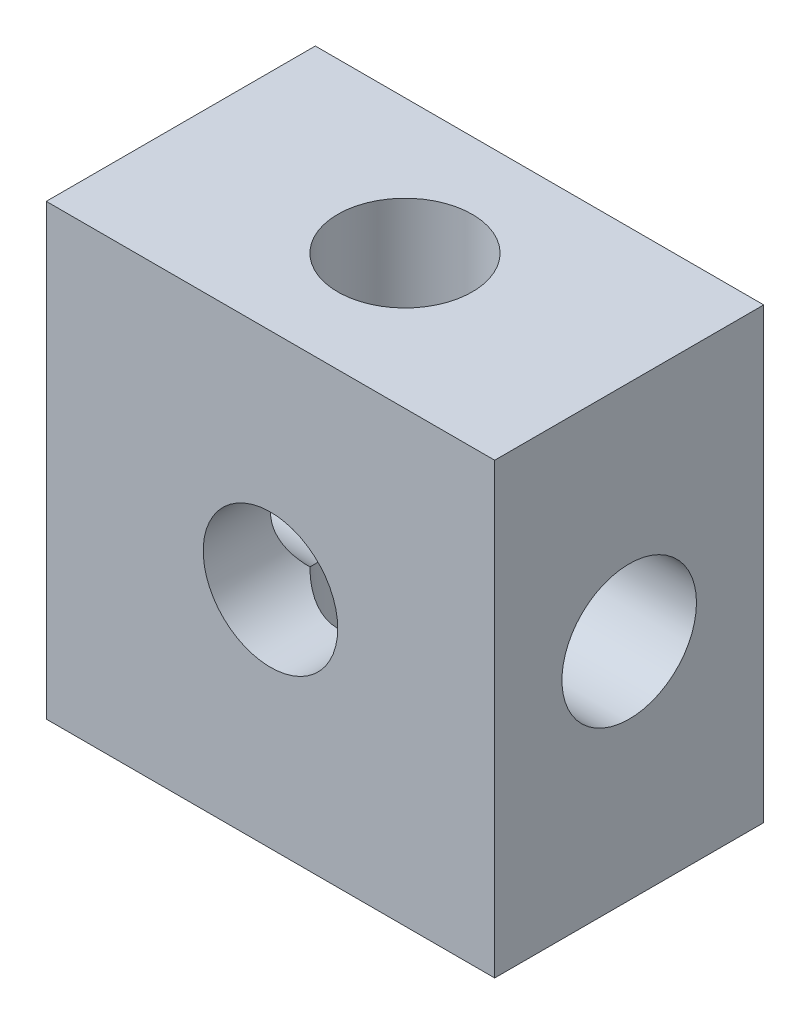
ISO-10303-21;
HEADER;
FILE_DESCRIPTION(('STEP AP214'),'2;1');
FILE_NAME('part.step','',(''),(''),'','','');
FILE_SCHEMA(('AUTOMOTIVE_DESIGN { 1 0 10303 214 1 1 1 1 }'));
ENDSEC;
DATA;
#1=APPLICATION_CONTEXT('core data for automotive mechanical design processes');
#2=APPLICATION_PROTOCOL_DEFINITION('international standard','automotive_design',2000,#1);
#3=PRODUCT_CONTEXT('',#1,'mechanical');
#4=PRODUCT('Part','Part','',(#3));
#5=PRODUCT_RELATED_PRODUCT_CATEGORY('part','',(#4));
#6=PRODUCT_DEFINITION_FORMATION('','',#4);
#7=PRODUCT_DEFINITION_CONTEXT('part definition',#1,'design');
#8=PRODUCT_DEFINITION('design','',#6,#7);
#9=PRODUCT_DEFINITION_SHAPE('','',#8);
#10=(LENGTH_UNIT() NAMED_UNIT(*) SI_UNIT(.MILLI.,.METRE.));
#11=(NAMED_UNIT(*) PLANE_ANGLE_UNIT() SI_UNIT($,.RADIAN.));
#12=(NAMED_UNIT(*) SI_UNIT($,.STERADIAN.) SOLID_ANGLE_UNIT());
#13=UNCERTAINTY_MEASURE_WITH_UNIT(LENGTH_MEASURE(1.E-05),#10,'distance_accuracy_value','');
#14=(GEOMETRIC_REPRESENTATION_CONTEXT(3) GLOBAL_UNCERTAINTY_ASSIGNED_CONTEXT((#13)) GLOBAL_UNIT_ASSIGNED_CONTEXT((#10,
#11,#12)) REPRESENTATION_CONTEXT('',''));
#15=CARTESIAN_POINT('',(0.,0.,0.));
#16=DIRECTION('',(0.,0.,1.));
#17=DIRECTION('',(1.,0.,0.));
#18=AXIS2_PLACEMENT_3D('',#15,#16,#17);
#19=CARTESIAN_POINT('',(0.,0.,0.));
#20=DIRECTION('',(0.,0.,1.));
#21=DIRECTION('',(1.,0.,0.));
#22=AXIS2_PLACEMENT_3D('',#19,#20,#21);
#23=CYLINDRICAL_SURFACE('',#22,1.5);
#24=CARTESIAN_POINT('',(0.,0.,6.));
#25=DIRECTION('',(0.,0.,1.));
#26=DIRECTION('',(1.,0.,0.));
#27=AXIS2_PLACEMENT_3D('',#24,#25,#26);
#28=CIRCLE('',#27,1.5);
#29=CARTESIAN_POINT('',(1.5,0.,6.));
#30=VERTEX_POINT('',#29);
#31=EDGE_CURVE('E144',#30,#30,#28,.T.);
#32=ORIENTED_EDGE('',*,*,#31,.T.);
#33=EDGE_LOOP('',(#32));
#34=FACE_BOUND('',#33,.T.);
#35=CARTESIAN_POINT('',(0.,0.,3.));
#36=DIRECTION('',(0.,0.707106781186547,0.707106781186548));
#37=DIRECTION('',(0.,-0.707106781186547,0.707106781186548));
#38=AXIS2_PLACEMENT_3D('',#35,#36,#37);
#39=ELLIPSE('',#38,2.12132034355964,1.5);
#40=CARTESIAN_POINT('',(1.06066017177982,-1.06066017177982,4.06066017177982));
#41=VERTEX_POINT('',#40);
#42=CARTESIAN_POINT('',(-1.06066017177982,-1.06066017177982,4.06066017177982));
#43=VERTEX_POINT('',#42);
#44=EDGE_CURVE('E108',#41,#43,#39,.F.);
#45=ORIENTED_EDGE('',*,*,#44,.T.);
#46=CARTESIAN_POINT('',(0.,0.,3.));
#47=DIRECTION('',(0.707106781186547,0.,0.707106781186547));
#48=DIRECTION('',(-0.707106781186547,0.,0.707106781186547));
#49=AXIS2_PLACEMENT_3D('',#46,#47,#48);
#50=ELLIPSE('',#49,2.12132034355964,1.5);
#51=CARTESIAN_POINT('',(-1.06066017177982,1.06066017177982,4.06066017177982));
#52=VERTEX_POINT('',#51);
#53=EDGE_CURVE('E54',#43,#52,#50,.F.);
#54=ORIENTED_EDGE('',*,*,#53,.T.);
#55=CARTESIAN_POINT('',(0.,0.,3.));
#56=DIRECTION('',(0.,-0.707106781186547,0.707106781186548));
#57=DIRECTION('',(0.,0.707106781186547,0.707106781186548));
#58=AXIS2_PLACEMENT_3D('',#55,#56,#57);
#59=ELLIPSE('',#58,2.12132034355964,1.5);
#60=CARTESIAN_POINT('',(1.06066017177982,1.06066017177982,4.06066017177982));
#61=VERTEX_POINT('',#60);
#62=EDGE_CURVE('E120',#52,#61,#59,.F.);
#63=ORIENTED_EDGE('',*,*,#62,.T.);
#64=CARTESIAN_POINT('',(0.,0.,3.));
#65=DIRECTION('',(-0.707106781186547,0.,0.707106781186547));
#66=DIRECTION('',(0.707106781186547,0.,0.707106781186547));
#67=AXIS2_PLACEMENT_3D('',#64,#65,#66);
#68=ELLIPSE('',#67,2.12132034355964,1.5);
#69=EDGE_CURVE('E131',#61,#41,#68,.F.);
#70=ORIENTED_EDGE('',*,*,#69,.T.);
#71=EDGE_LOOP('',(#45,#54,#63,#70));
#72=FACE_BOUND('',#71,.T.);
#73=ADVANCED_FACE('F39',(#34,#72),#23,.F.);
#74=CARTESIAN_POINT('',(-5.,-5.,6.));
#75=DIRECTION('',(1.,0.,0.));
#76=DIRECTION('',(0.,0.,-1.));
#77=AXIS2_PLACEMENT_3D('',#74,#75,#76);
#78=PLANE('',#77);
#79=CARTESIAN_POINT('',(-5.,0.,3.));
#80=DIRECTION('',(1.,0.,0.));
#81=DIRECTION('',(0.,0.,-1.));
#82=AXIS2_PLACEMENT_3D('',#79,#80,#81);
#83=CIRCLE('',#82,1.5);
#84=CARTESIAN_POINT('',(-5.,0.,1.5));
#85=VERTEX_POINT('',#84);
#86=EDGE_CURVE('E117',#85,#85,#83,.T.);
#87=ORIENTED_EDGE('',*,*,#86,.T.);
#88=EDGE_LOOP('',(#87));
#89=FACE_BOUND('',#88,.T.);
#90=DIRECTION('',(0.,-1.,0.));
#91=VECTOR('',#90,1.);
#92=CARTESIAN_POINT('',(-5.,-5.,0.));
#93=LINE('',#92,#91);
#94=CARTESIAN_POINT('',(-5.,5.,0.));
#95=VERTEX_POINT('',#94);
#96=CARTESIAN_POINT('',(-5.,-5.,0.));
#97=VERTEX_POINT('',#96);
#98=EDGE_CURVE('E150',#95,#97,#93,.T.);
#99=ORIENTED_EDGE('',*,*,#98,.T.);
#100=DIRECTION('',(0.,0.,-1.));
#101=VECTOR('',#100,1.);
#102=CARTESIAN_POINT('',(-5.,-5.,6.));
#103=LINE('',#102,#101);
#104=CARTESIAN_POINT('',(-5.,-5.,6.));
#105=VERTEX_POINT('',#104);
#106=EDGE_CURVE('E124',#105,#97,#103,.T.);
#107=ORIENTED_EDGE('',*,*,#106,.F.);
#108=DIRECTION('',(0.,-1.,0.));
#109=VECTOR('',#108,1.);
#110=CARTESIAN_POINT('',(-5.,-5.,6.));
#111=LINE('',#110,#109);
#112=CARTESIAN_POINT('',(-5.,5.,6.));
#113=VERTEX_POINT('',#112);
#114=EDGE_CURVE('E153',#113,#105,#111,.T.);
#115=ORIENTED_EDGE('',*,*,#114,.F.);
#116=DIRECTION('',(0.,0.,-1.));
#117=VECTOR('',#116,1.);
#118=CARTESIAN_POINT('',(-5.,5.,6.));
#119=LINE('',#118,#117);
#120=EDGE_CURVE('E163',#113,#95,#119,.T.);
#121=ORIENTED_EDGE('',*,*,#120,.T.);
#122=EDGE_LOOP('',(#99,#107,#115,#121));
#123=FACE_BOUND('',#122,.T.);
#124=ADVANCED_FACE('F41',(#89,#123),#78,.F.);
#125=CARTESIAN_POINT('',(5.,-5.,6.));
#126=DIRECTION('',(0.,1.,0.));
#127=DIRECTION('',(-1.,0.,0.));
#128=AXIS2_PLACEMENT_3D('',#125,#126,#127);
#129=PLANE('',#128);
#130=CARTESIAN_POINT('',(0.,-5.,3.));
#131=DIRECTION('',(0.,1.,0.));
#132=DIRECTION('',(-1.,0.,0.));
#133=AXIS2_PLACEMENT_3D('',#130,#131,#132);
#134=CIRCLE('',#133,1.5);
#135=CARTESIAN_POINT('',(-1.5,-5.,3.));
#136=VERTEX_POINT('',#135);
#137=EDGE_CURVE('E141',#136,#136,#134,.T.);
#138=ORIENTED_EDGE('',*,*,#137,.T.);
#139=EDGE_LOOP('',(#138));
#140=FACE_BOUND('',#139,.T.);
#141=DIRECTION('',(1.,0.,0.));
#142=VECTOR('',#141,1.);
#143=CARTESIAN_POINT('',(5.,-5.,0.));
#144=LINE('',#143,#142);
#145=CARTESIAN_POINT('',(5.,-5.,0.));
#146=VERTEX_POINT('',#145);
#147=EDGE_CURVE('E166',#97,#146,#144,.T.);
#148=ORIENTED_EDGE('',*,*,#147,.T.);
#149=DIRECTION('',(0.,0.,-1.));
#150=VECTOR('',#149,1.);
#151=CARTESIAN_POINT('',(5.,-5.,6.));
#152=LINE('',#151,#150);
#153=CARTESIAN_POINT('',(5.,-5.,6.));
#154=VERTEX_POINT('',#153);
#155=EDGE_CURVE('E176',#154,#146,#152,.T.);
#156=ORIENTED_EDGE('',*,*,#155,.F.);
#157=DIRECTION('',(1.,0.,0.));
#158=VECTOR('',#157,1.);
#159=CARTESIAN_POINT('',(5.,-5.,6.));
#160=LINE('',#159,#158);
#161=EDGE_CURVE('E156',#105,#154,#160,.T.);
#162=ORIENTED_EDGE('',*,*,#161,.F.);
#163=ORIENTED_EDGE('',*,*,#106,.T.);
#164=EDGE_LOOP('',(#148,#156,#162,#163));
#165=FACE_BOUND('',#164,.T.);
#166=ADVANCED_FACE('F181',(#140,#165),#129,.F.);
#167=CARTESIAN_POINT('',(5.,-5.,6.));
#168=DIRECTION('',(-1.,0.,0.));
#169=DIRECTION('',(0.,0.,1.));
#170=AXIS2_PLACEMENT_3D('',#167,#168,#169);
#171=PLANE('',#170);
#172=CARTESIAN_POINT('',(5.,0.,3.));
#173=DIRECTION('',(1.,0.,0.));
#174=DIRECTION('',(0.,0.,-1.));
#175=AXIS2_PLACEMENT_3D('',#172,#173,#174);
#176=CIRCLE('',#175,1.5);
#177=CARTESIAN_POINT('',(5.,0.,1.5));
#178=VERTEX_POINT('',#177);
#179=EDGE_CURVE('E242',#178,#178,#176,.T.);
#180=ORIENTED_EDGE('',*,*,#179,.F.);
#181=EDGE_LOOP('',(#180));
#182=FACE_BOUND('',#181,.T.);
#183=DIRECTION('',(0.,1.,0.));
#184=VECTOR('',#183,1.);
#185=CARTESIAN_POINT('',(5.,-5.,0.));
#186=LINE('',#185,#184);
#187=CARTESIAN_POINT('',(5.,5.,0.));
#188=VERTEX_POINT('',#187);
#189=EDGE_CURVE('E168',#146,#188,#186,.T.);
#190=ORIENTED_EDGE('',*,*,#189,.T.);
#191=DIRECTION('',(0.,0.,-1.));
#192=VECTOR('',#191,1.);
#193=CARTESIAN_POINT('',(5.,5.,6.));
#194=LINE('',#193,#192);
#195=CARTESIAN_POINT('',(5.,5.,6.));
#196=VERTEX_POINT('',#195);
#197=EDGE_CURVE('E173',#196,#188,#194,.T.);
#198=ORIENTED_EDGE('',*,*,#197,.F.);
#199=DIRECTION('',(0.,1.,0.));
#200=VECTOR('',#199,1.);
#201=CARTESIAN_POINT('',(5.,-5.,6.));
#202=LINE('',#201,#200);
#203=EDGE_CURVE('E159',#154,#196,#202,.T.);
#204=ORIENTED_EDGE('',*,*,#203,.F.);
#205=ORIENTED_EDGE('',*,*,#155,.T.);
#206=EDGE_LOOP('',(#190,#198,#204,#205));
#207=FACE_BOUND('',#206,.T.);
#208=ADVANCED_FACE('F193',(#182,#207),#171,.F.);
#209=CARTESIAN_POINT('',(5.,5.,6.));
#210=DIRECTION('',(0.,-1.,0.));
#211=DIRECTION('',(1.,0.,0.));
#212=AXIS2_PLACEMENT_3D('',#209,#210,#211);
#213=PLANE('',#212);
#214=CARTESIAN_POINT('',(0.,5.,3.));
#215=DIRECTION('',(0.,1.,0.));
#216=DIRECTION('',(-1.,0.,0.));
#217=AXIS2_PLACEMENT_3D('',#214,#215,#216);
#218=CIRCLE('',#217,1.5);
#219=CARTESIAN_POINT('',(-1.5,5.,3.));
#220=VERTEX_POINT('',#219);
#221=EDGE_CURVE('E135',#220,#220,#218,.T.);
#222=ORIENTED_EDGE('',*,*,#221,.F.);
#223=EDGE_LOOP('',(#222));
#224=FACE_BOUND('',#223,.T.);
#225=DIRECTION('',(-1.,0.,0.));
#226=VECTOR('',#225,1.);
#227=CARTESIAN_POINT('',(5.,5.,0.));
#228=LINE('',#227,#226);
#229=EDGE_CURVE('E157',#188,#95,#228,.T.);
#230=ORIENTED_EDGE('',*,*,#229,.T.);
#231=ORIENTED_EDGE('',*,*,#120,.F.);
#232=DIRECTION('',(-1.,0.,0.));
#233=VECTOR('',#232,1.);
#234=CARTESIAN_POINT('',(5.,5.,6.));
#235=LINE('',#234,#233);
#236=EDGE_CURVE('E161',#196,#113,#235,.T.);
#237=ORIENTED_EDGE('',*,*,#236,.F.);
#238=ORIENTED_EDGE('',*,*,#197,.T.);
#239=EDGE_LOOP('',(#230,#231,#237,#238));
#240=FACE_BOUND('',#239,.T.);
#241=ADVANCED_FACE('F197',(#224,#240),#213,.F.);
#242=CARTESIAN_POINT('',(0.,0.,6.));
#243=DIRECTION('',(0.,0.,1.));
#244=DIRECTION('',(1.,0.,0.));
#245=AXIS2_PLACEMENT_3D('',#242,#243,#244);
#246=PLANE('',#245);
#247=ORIENTED_EDGE('',*,*,#31,.F.);
#248=EDGE_LOOP('',(#247));
#249=FACE_BOUND('',#248,.T.);
#250=ORIENTED_EDGE('',*,*,#114,.T.);
#251=ORIENTED_EDGE('',*,*,#161,.T.);
#252=ORIENTED_EDGE('',*,*,#203,.T.);
#253=ORIENTED_EDGE('',*,*,#236,.T.);
#254=EDGE_LOOP('',(#250,#251,#252,#253));
#255=FACE_BOUND('',#254,.T.);
#256=ADVANCED_FACE('F199',(#249,#255),#246,.T.);
#257=CARTESIAN_POINT('',(0.,0.,0.));
#258=DIRECTION('',(0.,0.,1.));
#259=DIRECTION('',(1.,0.,0.));
#260=AXIS2_PLACEMENT_3D('',#257,#258,#259);
#261=PLANE('',#260);
#262=CARTESIAN_POINT('',(0.,0.,0.));
#263=DIRECTION('',(0.,0.,1.));
#264=DIRECTION('',(1.,0.,0.));
#265=AXIS2_PLACEMENT_3D('',#262,#263,#264);
#266=CIRCLE('',#265,1.5);
#267=CARTESIAN_POINT('',(1.5,0.,0.));
#268=VERTEX_POINT('',#267);
#269=EDGE_CURVE('E147',#268,#268,#266,.T.);
#270=ORIENTED_EDGE('',*,*,#269,.T.);
#271=EDGE_LOOP('',(#270));
#272=FACE_BOUND('',#271,.T.);
#273=ORIENTED_EDGE('',*,*,#98,.F.);
#274=ORIENTED_EDGE('',*,*,#229,.F.);
#275=ORIENTED_EDGE('',*,*,#189,.F.);
#276=ORIENTED_EDGE('',*,*,#147,.F.);
#277=EDGE_LOOP('',(#273,#274,#275,#276));
#278=FACE_BOUND('',#277,.T.);
#279=ADVANCED_FACE('F189',(#272,#278),#261,.F.);
#280=CARTESIAN_POINT('',(0.,0.,3.));
#281=DIRECTION('',(0.,-0.707106781186547,0.707106781186548));
#282=DIRECTION('',(0.,0.707106781186547,0.707106781186548));
#283=AXIS2_PLACEMENT_3D('',#280,#281,#282);
#284=ELLIPSE('',#283,2.12132034355964,1.5);
#285=CARTESIAN_POINT('',(-1.06066017177982,-1.06066017177982,1.93933982822018));
#286=VERTEX_POINT('',#285);
#287=CARTESIAN_POINT('',(1.06066017177982,-1.06066017177982,1.93933982822018));
#288=VERTEX_POINT('',#287);
#289=EDGE_CURVE('E114',#286,#288,#284,.T.);
#290=ORIENTED_EDGE('',*,*,#289,.T.);
#291=CARTESIAN_POINT('',(0.,0.,3.));
#292=DIRECTION('',(0.707106781186547,0.,0.707106781186547));
#293=DIRECTION('',(-0.707106781186547,0.,0.707106781186547));
#294=AXIS2_PLACEMENT_3D('',#291,#292,#293);
#295=ELLIPSE('',#294,2.12132034355964,1.5);
#296=CARTESIAN_POINT('',(1.06066017177982,1.06066017177982,1.93933982822018));
#297=VERTEX_POINT('',#296);
#298=EDGE_CURVE('E62',#288,#297,#295,.T.);
#299=ORIENTED_EDGE('',*,*,#298,.T.);
#300=CARTESIAN_POINT('',(0.,0.,3.));
#301=DIRECTION('',(0.,0.707106781186547,0.707106781186548));
#302=DIRECTION('',(0.,-0.707106781186547,0.707106781186548));
#303=AXIS2_PLACEMENT_3D('',#300,#301,#302);
#304=ELLIPSE('',#303,2.12132034355964,1.5);
#305=CARTESIAN_POINT('',(-1.06066017177982,1.06066017177982,1.93933982822018));
#306=VERTEX_POINT('',#305);
#307=EDGE_CURVE('E116',#297,#306,#304,.T.);
#308=ORIENTED_EDGE('',*,*,#307,.T.);
#309=CARTESIAN_POINT('',(0.,0.,3.));
#310=DIRECTION('',(-0.707106781186547,0.,0.707106781186547));
#311=DIRECTION('',(0.707106781186547,0.,0.707106781186547));
#312=AXIS2_PLACEMENT_3D('',#309,#310,#311);
#313=ELLIPSE('',#312,2.12132034355964,1.5);
#314=EDGE_CURVE('E102',#306,#286,#313,.T.);
#315=ORIENTED_EDGE('',*,*,#314,.T.);
#316=EDGE_LOOP('',(#290,#299,#308,#315));
#317=FACE_BOUND('',#316,.T.);
#318=ORIENTED_EDGE('',*,*,#269,.F.);
#319=EDGE_LOOP('',(#318));
#320=FACE_BOUND('',#319,.T.);
#321=ADVANCED_FACE('F112',(#317,#320),#23,.F.);
#322=CARTESIAN_POINT('',(0.,-5.,3.));
#323=DIRECTION('',(0.,1.,0.));
#324=DIRECTION('',(-1.,0.,0.));
#325=AXIS2_PLACEMENT_3D('',#322,#323,#324);
#326=CYLINDRICAL_SURFACE('',#325,1.5);
#327=ORIENTED_EDGE('',*,*,#221,.T.);
#328=EDGE_LOOP('',(#327));
#329=FACE_BOUND('',#328,.T.);
#330=ORIENTED_EDGE('',*,*,#62,.F.);
#331=CARTESIAN_POINT('',(0.,0.,3.));
#332=DIRECTION('',(0.707106781186547,0.707106781186547,0.));
#333=DIRECTION('',(-0.707106781186548,0.707106781186547,0.));
#334=AXIS2_PLACEMENT_3D('',#331,#332,#333);
#335=ELLIPSE('',#334,2.12132034355964,1.5);
#336=EDGE_CURVE('E137',#52,#306,#335,.F.);
#337=ORIENTED_EDGE('',*,*,#336,.T.);
#338=ORIENTED_EDGE('',*,*,#307,.F.);
#339=CARTESIAN_POINT('',(0.,0.,3.));
#340=DIRECTION('',(-0.707106781186548,0.707106781186547,0.));
#341=DIRECTION('',(0.707106781186547,0.707106781186547,0.));
#342=AXIS2_PLACEMENT_3D('',#339,#340,#341);
#343=ELLIPSE('',#342,2.12132034355964,1.5);
#344=EDGE_CURVE('E133',#297,#61,#343,.F.);
#345=ORIENTED_EDGE('',*,*,#344,.T.);
#346=EDGE_LOOP('',(#330,#337,#338,#345));
#347=FACE_BOUND('',#346,.T.);
#348=ADVANCED_FACE('F221',(#329,#347),#326,.F.);
#349=ORIENTED_EDGE('',*,*,#137,.F.);
#350=EDGE_LOOP('',(#349));
#351=FACE_BOUND('',#350,.T.);
#352=ORIENTED_EDGE('',*,*,#44,.F.);
#353=CARTESIAN_POINT('',(0.,0.,3.));
#354=DIRECTION('',(0.707106781186547,0.707106781186547,0.));
#355=DIRECTION('',(-0.707106781186548,0.707106781186547,0.));
#356=AXIS2_PLACEMENT_3D('',#353,#354,#355);
#357=ELLIPSE('',#356,2.12132034355964,1.5);
#358=EDGE_CURVE('E11',#41,#288,#357,.T.);
#359=ORIENTED_EDGE('',*,*,#358,.T.);
#360=ORIENTED_EDGE('',*,*,#289,.F.);
#361=CARTESIAN_POINT('',(0.,0.,3.));
#362=DIRECTION('',(-0.707106781186548,0.707106781186547,0.));
#363=DIRECTION('',(0.707106781186547,0.707106781186547,0.));
#364=AXIS2_PLACEMENT_3D('',#361,#362,#363);
#365=ELLIPSE('',#364,2.12132034355964,1.5);
#366=EDGE_CURVE('E47',#286,#43,#365,.T.);
#367=ORIENTED_EDGE('',*,*,#366,.T.);
#368=EDGE_LOOP('',(#352,#359,#360,#367));
#369=FACE_BOUND('',#368,.T.);
#370=ADVANCED_FACE('F119',(#351,#369),#326,.F.);
#371=CARTESIAN_POINT('',(-5.,0.,3.));
#372=DIRECTION('',(1.,0.,0.));
#373=DIRECTION('',(0.,0.,-1.));
#374=AXIS2_PLACEMENT_3D('',#371,#372,#373);
#375=CYLINDRICAL_SURFACE('',#374,1.5);
#376=ORIENTED_EDGE('',*,*,#86,.F.);
#377=EDGE_LOOP('',(#376));
#378=FACE_BOUND('',#377,.T.);
#379=ORIENTED_EDGE('',*,*,#53,.F.);
#380=ORIENTED_EDGE('',*,*,#366,.F.);
#381=ORIENTED_EDGE('',*,*,#314,.F.);
#382=ORIENTED_EDGE('',*,*,#336,.F.);
#383=EDGE_LOOP('',(#379,#380,#381,#382));
#384=FACE_BOUND('',#383,.T.);
#385=ADVANCED_FACE('F101',(#378,#384),#375,.F.);
#386=ORIENTED_EDGE('',*,*,#179,.T.);
#387=EDGE_LOOP('',(#386));
#388=FACE_BOUND('',#387,.T.);
#389=ORIENTED_EDGE('',*,*,#298,.F.);
#390=ORIENTED_EDGE('',*,*,#358,.F.);
#391=ORIENTED_EDGE('',*,*,#69,.F.);
#392=ORIENTED_EDGE('',*,*,#344,.F.);
#393=EDGE_LOOP('',(#389,#390,#391,#392));
#394=FACE_BOUND('',#393,.T.);
#395=ADVANCED_FACE('F233',(#388,#394),#375,.F.);
#396=CLOSED_SHELL('',(#73,#124,#166,#208,#241,#256,#279,#321,#348,#370,#385,#395));
#397=MANIFOLD_SOLID_BREP('B2',#396);
#398=ADVANCED_BREP_SHAPE_REPRESENTATION('',(#18,#397),#14);
#399=SHAPE_DEFINITION_REPRESENTATION(#9,#398);
ENDSEC;
END-ISO-10303-21;
